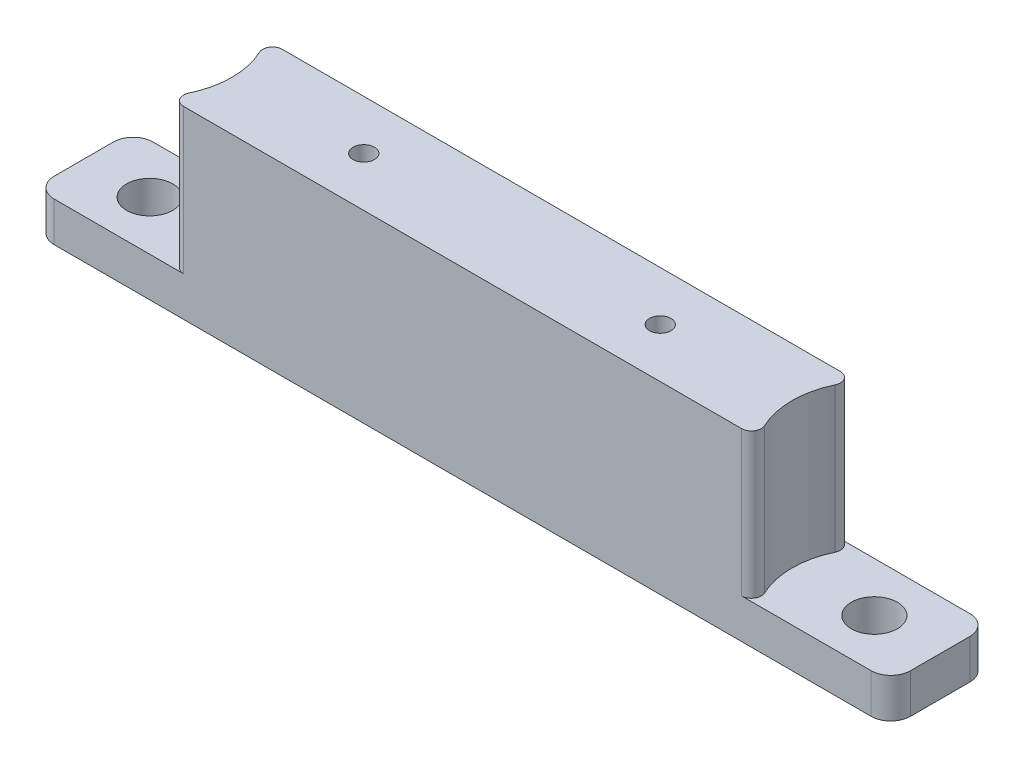
ISO-10303-21;
HEADER;
FILE_DESCRIPTION(('STEP AP214'),'2;1');
FILE_NAME('part.step','',(''),(''),'','','');
FILE_SCHEMA(('AUTOMOTIVE_DESIGN { 1 0 10303 214 1 1 1 1 }'));
ENDSEC;
DATA;
#1=APPLICATION_CONTEXT('core data for automotive mechanical design processes');
#2=APPLICATION_PROTOCOL_DEFINITION('international standard','automotive_design',2000,#1);
#3=PRODUCT_CONTEXT('',#1,'mechanical');
#4=PRODUCT('Part','Part','',(#3));
#5=PRODUCT_RELATED_PRODUCT_CATEGORY('part','',(#4));
#6=PRODUCT_DEFINITION_FORMATION('','',#4);
#7=PRODUCT_DEFINITION_CONTEXT('part definition',#1,'design');
#8=PRODUCT_DEFINITION('design','',#6,#7);
#9=PRODUCT_DEFINITION_SHAPE('','',#8);
#10=(LENGTH_UNIT() NAMED_UNIT(*) SI_UNIT(.MILLI.,.METRE.));
#11=(NAMED_UNIT(*) PLANE_ANGLE_UNIT() SI_UNIT($,.RADIAN.));
#12=(NAMED_UNIT(*) SI_UNIT($,.STERADIAN.) SOLID_ANGLE_UNIT());
#13=UNCERTAINTY_MEASURE_WITH_UNIT(LENGTH_MEASURE(1.E-05),#10,'distance_accuracy_value','');
#14=(GEOMETRIC_REPRESENTATION_CONTEXT(3) GLOBAL_UNCERTAINTY_ASSIGNED_CONTEXT((#13)) GLOBAL_UNIT_ASSIGNED_CONTEXT((#10,
#11,#12)) REPRESENTATION_CONTEXT('',''));
#15=CARTESIAN_POINT('',(0.,0.,0.));
#16=DIRECTION('',(0.,0.,1.));
#17=DIRECTION('',(1.,0.,0.));
#18=AXIS2_PLACEMENT_3D('',#15,#16,#17);
#19=CARTESIAN_POINT('',(87.5,-0.001000000000001,-7.5));
#20=DIRECTION('',(0.,1.,0.));
#21=DIRECTION('',(0.,0.,1.));
#22=AXIS2_PLACEMENT_3D('',#19,#20,#21);
#23=CYLINDRICAL_SURFACE('',#22,1.625);
#24=CARTESIAN_POINT('',(87.5,28.,-7.5));
#25=DIRECTION('',(0.,1.,0.));
#26=DIRECTION('',(0.,0.,1.));
#27=AXIS2_PLACEMENT_3D('',#24,#25,#26);
#28=CIRCLE('',#27,1.625);
#29=CARTESIAN_POINT('',(87.5,28.,-5.875));
#30=VERTEX_POINT('',#29);
#31=EDGE_CURVE('E191',#30,#30,#28,.T.);
#32=ORIENTED_EDGE('',*,*,#31,.T.);
#33=EDGE_LOOP('',(#32));
#34=FACE_BOUND('',#33,.T.);
#35=CARTESIAN_POINT('',(87.5,25.5,-7.5));
#36=DIRECTION('',(0.,-1.,0.));
#37=DIRECTION('',(0.,0.,-1.));
#38=AXIS2_PLACEMENT_3D('',#35,#36,#37);
#39=CIRCLE('',#38,1.625);
#40=CARTESIAN_POINT('',(87.5,25.5,-9.12500000000001));
#41=VERTEX_POINT('',#40);
#42=EDGE_CURVE('E187',#41,#41,#39,.F.);
#43=ORIENTED_EDGE('',*,*,#42,.F.);
#44=EDGE_LOOP('',(#43));
#45=FACE_BOUND('',#44,.T.);
#46=ADVANCED_FACE('F33',(#34,#45),#23,.F.);
#47=CARTESIAN_POINT('',(42.5,-0.001000000000001,-7.5));
#48=DIRECTION('',(0.,1.,0.));
#49=DIRECTION('',(0.,0.,1.));
#50=AXIS2_PLACEMENT_3D('',#47,#48,#49);
#51=CYLINDRICAL_SURFACE('',#50,1.625);
#52=CARTESIAN_POINT('',(42.5,28.,-7.5));
#53=DIRECTION('',(0.,1.,0.));
#54=DIRECTION('',(0.,0.,1.));
#55=AXIS2_PLACEMENT_3D('',#52,#53,#54);
#56=CIRCLE('',#55,1.625);
#57=CARTESIAN_POINT('',(42.5,28.,-5.875));
#58=VERTEX_POINT('',#57);
#59=EDGE_CURVE('E373',#58,#58,#56,.T.);
#60=ORIENTED_EDGE('',*,*,#59,.T.);
#61=EDGE_LOOP('',(#60));
#62=FACE_BOUND('',#61,.T.);
#63=CARTESIAN_POINT('',(42.5,25.5,-7.5));
#64=DIRECTION('',(0.,-1.,0.));
#65=DIRECTION('',(0.,0.,-1.));
#66=AXIS2_PLACEMENT_3D('',#63,#64,#65);
#67=CIRCLE('',#66,1.625);
#68=CARTESIAN_POINT('',(42.5,25.5,-9.12500000000001));
#69=VERTEX_POINT('',#68);
#70=EDGE_CURVE('E184',#69,#69,#67,.F.);
#71=ORIENTED_EDGE('',*,*,#70,.F.);
#72=EDGE_LOOP('',(#71));
#73=FACE_BOUND('',#72,.T.);
#74=ADVANCED_FACE('F305',(#62,#73),#51,.F.);
#75=CARTESIAN_POINT('',(0.,28.,0.));
#76=DIRECTION('',(0.,1.,0.));
#77=DIRECTION('',(0.,0.,1.));
#78=AXIS2_PLACEMENT_3D('',#75,#76,#77);
#79=PLANE('',#78);
#80=ORIENTED_EDGE('',*,*,#59,.F.);
#81=EDGE_LOOP('',(#80));
#82=FACE_BOUND('',#81,.T.);
#83=ORIENTED_EDGE('',*,*,#31,.F.);
#84=EDGE_LOOP('',(#83));
#85=FACE_BOUND('',#84,.T.);
#86=CARTESIAN_POINT('',(120.,28.,-7.5));
#87=DIRECTION('',(0.,1.,0.));
#88=DIRECTION('',(0.,0.,1.));
#89=AXIS2_PLACEMENT_3D('',#86,#87,#88);
#90=CIRCLE('',#89,12.5);
#91=CARTESIAN_POINT('',(108.706151213684,28.,-12.8571428571429));
#92=VERTEX_POINT('',#91);
#93=CARTESIAN_POINT('',(108.706151213684,28.,-2.14285714285714));
#94=VERTEX_POINT('',#93);
#95=EDGE_CURVE('E368',#92,#94,#90,.T.);
#96=ORIENTED_EDGE('',*,*,#95,.F.);
#97=CARTESIAN_POINT('',(107.350889359326,28.,-13.5));
#98=DIRECTION('',(0.,1.,0.));
#99=DIRECTION('',(0.,0.,1.));
#100=AXIS2_PLACEMENT_3D('',#97,#98,#99);
#101=CIRCLE('',#100,1.5);
#102=CARTESIAN_POINT('',(107.350889359326,28.,-15.));
#103=VERTEX_POINT('',#102);
#104=EDGE_CURVE('E232',#92,#103,#101,.T.);
#105=ORIENTED_EDGE('',*,*,#104,.T.);
#106=DIRECTION('',(-1.,0.,0.));
#107=VECTOR('',#106,1.);
#108=CARTESIAN_POINT('',(20.,28.,-15.));
#109=LINE('',#108,#107);
#110=CARTESIAN_POINT('',(22.6491106406735,28.,-15.));
#111=VERTEX_POINT('',#110);
#112=EDGE_CURVE('E255',#103,#111,#109,.T.);
#113=ORIENTED_EDGE('',*,*,#112,.T.);
#114=CARTESIAN_POINT('',(22.6491106406735,28.,-13.5));
#115=DIRECTION('',(0.,1.,0.));
#116=DIRECTION('',(0.,0.,1.));
#117=AXIS2_PLACEMENT_3D('',#114,#115,#116);
#118=CIRCLE('',#117,1.5);
#119=CARTESIAN_POINT('',(21.2938487863156,28.,-12.8571428571429));
#120=VERTEX_POINT('',#119);
#121=EDGE_CURVE('E228',#111,#120,#118,.T.);
#122=ORIENTED_EDGE('',*,*,#121,.T.);
#123=CARTESIAN_POINT('',(10.,28.,-7.5));
#124=DIRECTION('',(0.,1.,0.));
#125=DIRECTION('',(0.,0.,1.));
#126=AXIS2_PLACEMENT_3D('',#123,#124,#125);
#127=CIRCLE('',#126,12.5);
#128=CARTESIAN_POINT('',(21.2938487863156,28.,-2.14285714285714));
#129=VERTEX_POINT('',#128);
#130=EDGE_CURVE('E360',#129,#120,#127,.T.);
#131=ORIENTED_EDGE('',*,*,#130,.F.);
#132=CARTESIAN_POINT('',(22.6491106406735,28.,-1.5));
#133=DIRECTION('',(0.,1.,0.));
#134=DIRECTION('',(0.,0.,1.));
#135=AXIS2_PLACEMENT_3D('',#132,#133,#134);
#136=CIRCLE('',#135,1.5);
#137=CARTESIAN_POINT('',(22.6491106406735,28.,0.));
#138=VERTEX_POINT('',#137);
#139=EDGE_CURVE('E226',#129,#138,#136,.T.);
#140=ORIENTED_EDGE('',*,*,#139,.T.);
#141=DIRECTION('',(1.,0.,0.));
#142=VECTOR('',#141,1.);
#143=CARTESIAN_POINT('',(20.,28.,0.));
#144=LINE('',#143,#142);
#145=CARTESIAN_POINT('',(107.350889359326,28.,0.));
#146=VERTEX_POINT('',#145);
#147=EDGE_CURVE('E264',#138,#146,#144,.T.);
#148=ORIENTED_EDGE('',*,*,#147,.T.);
#149=CARTESIAN_POINT('',(107.350889359326,28.,-1.5));
#150=DIRECTION('',(0.,1.,0.));
#151=DIRECTION('',(0.,0.,1.));
#152=AXIS2_PLACEMENT_3D('',#149,#150,#151);
#153=CIRCLE('',#152,1.5);
#154=EDGE_CURVE('E230',#146,#94,#153,.T.);
#155=ORIENTED_EDGE('',*,*,#154,.T.);
#156=EDGE_LOOP('',(#96,#105,#113,#122,#131,#140,#148,#155));
#157=FACE_BOUND('',#156,.T.);
#158=ADVANCED_FACE('F259',(#82,#85,#157),#79,.T.);
#159=CARTESIAN_POINT('',(0.,6.,0.));
#160=DIRECTION('',(0.,-1.,0.));
#161=DIRECTION('',(0.,0.,-1.));
#162=AXIS2_PLACEMENT_3D('',#159,#160,#161);
#163=PLANE('',#162);
#164=CARTESIAN_POINT('',(10.,6.,-7.5));
#165=DIRECTION('',(0.,1.,0.));
#166=DIRECTION('',(0.,0.,1.));
#167=AXIS2_PLACEMENT_3D('',#164,#165,#166);
#168=CIRCLE('',#167,3.5);
#169=CARTESIAN_POINT('',(10.,6.,-4.));
#170=VERTEX_POINT('',#169);
#171=EDGE_CURVE('E269',#170,#170,#168,.T.);
#172=ORIENTED_EDGE('',*,*,#171,.F.);
#173=EDGE_LOOP('',(#172));
#174=FACE_BOUND('',#173,.T.);
#175=DIRECTION('',(-1.,0.,0.));
#176=VECTOR('',#175,1.);
#177=CARTESIAN_POINT('',(0.,6.,-15.));
#178=LINE('',#177,#176);
#179=CARTESIAN_POINT('',(22.6491106406735,6.,-15.));
#180=VERTEX_POINT('',#179);
#181=CARTESIAN_POINT('',(3.,6.,-15.));
#182=VERTEX_POINT('',#181);
#183=EDGE_CURVE('E249',#180,#182,#178,.T.);
#184=ORIENTED_EDGE('',*,*,#183,.T.);
#185=CARTESIAN_POINT('',(3.,6.,-12.));
#186=DIRECTION('',(0.,-1.,0.));
#187=DIRECTION('',(0.,0.,-1.));
#188=AXIS2_PLACEMENT_3D('',#185,#186,#187);
#189=CIRCLE('',#188,3.);
#190=CARTESIAN_POINT('',(0.,6.,-12.));
#191=VERTEX_POINT('',#190);
#192=EDGE_CURVE('E215',#182,#191,#189,.F.);
#193=ORIENTED_EDGE('',*,*,#192,.T.);
#194=DIRECTION('',(0.,0.,1.));
#195=VECTOR('',#194,1.);
#196=CARTESIAN_POINT('',(0.,6.,0.));
#197=LINE('',#196,#195);
#198=CARTESIAN_POINT('',(0.,6.,-3.));
#199=VERTEX_POINT('',#198);
#200=EDGE_CURVE('E174',#191,#199,#197,.T.);
#201=ORIENTED_EDGE('',*,*,#200,.T.);
#202=CARTESIAN_POINT('',(3.,6.,-3.));
#203=DIRECTION('',(0.,-1.,0.));
#204=DIRECTION('',(0.,0.,-1.));
#205=AXIS2_PLACEMENT_3D('',#202,#203,#204);
#206=CIRCLE('',#205,3.);
#207=CARTESIAN_POINT('',(3.,6.,0.));
#208=VERTEX_POINT('',#207);
#209=EDGE_CURVE('E213',#199,#208,#206,.F.);
#210=ORIENTED_EDGE('',*,*,#209,.T.);
#211=DIRECTION('',(1.,0.,0.));
#212=VECTOR('',#211,1.);
#213=CARTESIAN_POINT('',(0.,6.,0.));
#214=LINE('',#213,#212);
#215=CARTESIAN_POINT('',(22.6491106406735,6.,0.));
#216=VERTEX_POINT('',#215);
#217=EDGE_CURVE('E273',#208,#216,#214,.T.);
#218=ORIENTED_EDGE('',*,*,#217,.T.);
#219=CARTESIAN_POINT('',(22.6491106406735,6.,-1.5));
#220=DIRECTION('',(0.,-1.,0.));
#221=DIRECTION('',(0.,0.,-1.));
#222=AXIS2_PLACEMENT_3D('',#219,#220,#221);
#223=CIRCLE('',#222,1.5);
#224=CARTESIAN_POINT('',(21.2938487863156,6.,-2.14285714285714));
#225=VERTEX_POINT('',#224);
#226=EDGE_CURVE('E11',#216,#225,#223,.T.);
#227=ORIENTED_EDGE('',*,*,#226,.T.);
#228=CARTESIAN_POINT('',(10.,6.,-7.5));
#229=DIRECTION('',(0.,1.,0.));
#230=DIRECTION('',(0.,0.,1.));
#231=AXIS2_PLACEMENT_3D('',#228,#229,#230);
#232=CIRCLE('',#231,12.5);
#233=CARTESIAN_POINT('',(21.2938487863156,6.,-12.8571428571429));
#234=VERTEX_POINT('',#233);
#235=EDGE_CURVE('E251',#225,#234,#232,.T.);
#236=ORIENTED_EDGE('',*,*,#235,.T.);
#237=CARTESIAN_POINT('',(22.6491106406735,6.,-13.5));
#238=DIRECTION('',(0.,-1.,0.));
#239=DIRECTION('',(0.,0.,-1.));
#240=AXIS2_PLACEMENT_3D('',#237,#238,#239);
#241=CIRCLE('',#240,1.5);
#242=EDGE_CURVE('E41',#234,#180,#241,.T.);
#243=ORIENTED_EDGE('',*,*,#242,.T.);
#244=EDGE_LOOP('',(#184,#193,#201,#210,#218,#227,#236,#243));
#245=FACE_BOUND('',#244,.T.);
#246=ADVANCED_FACE('F248',(#174,#245),#163,.F.);
#247=CARTESIAN_POINT('',(120.,6.,-7.5));
#248=DIRECTION('',(0.,1.,0.));
#249=DIRECTION('',(0.,0.,1.));
#250=AXIS2_PLACEMENT_3D('',#247,#248,#249);
#251=CIRCLE('',#250,3.50000000000001);
#252=CARTESIAN_POINT('',(120.,6.,-3.99999999999999));
#253=VERTEX_POINT('',#252);
#254=EDGE_CURVE('E359',#253,#253,#251,.T.);
#255=ORIENTED_EDGE('',*,*,#254,.F.);
#256=EDGE_LOOP('',(#255));
#257=FACE_BOUND('',#256,.T.);
#258=DIRECTION('',(0.,0.,-1.));
#259=VECTOR('',#258,1.);
#260=CARTESIAN_POINT('',(130.,6.,0.));
#261=LINE('',#260,#259);
#262=CARTESIAN_POINT('',(130.,6.,-3.));
#263=VERTEX_POINT('',#262);
#264=CARTESIAN_POINT('',(130.,6.,-12.));
#265=VERTEX_POINT('',#264);
#266=EDGE_CURVE('E275',#263,#265,#261,.T.);
#267=ORIENTED_EDGE('',*,*,#266,.T.);
#268=CARTESIAN_POINT('',(127.,6.,-12.));
#269=DIRECTION('',(0.,-1.,0.));
#270=DIRECTION('',(0.,0.,-1.));
#271=AXIS2_PLACEMENT_3D('',#268,#269,#270);
#272=CIRCLE('',#271,3.);
#273=CARTESIAN_POINT('',(127.,6.,-15.));
#274=VERTEX_POINT('',#273);
#275=EDGE_CURVE('E201',#265,#274,#272,.F.);
#276=ORIENTED_EDGE('',*,*,#275,.T.);
#277=CARTESIAN_POINT('',(107.350889359326,6.,-15.));
#278=VERTEX_POINT('',#277);
#279=EDGE_CURVE('E167',#274,#278,#178,.T.);
#280=ORIENTED_EDGE('',*,*,#279,.T.);
#281=CARTESIAN_POINT('',(107.350889359326,6.,-13.5));
#282=DIRECTION('',(0.,-1.,0.));
#283=DIRECTION('',(0.,0.,-1.));
#284=AXIS2_PLACEMENT_3D('',#281,#282,#283);
#285=CIRCLE('',#284,1.5);
#286=CARTESIAN_POINT('',(108.706151213684,6.,-12.8571428571429));
#287=VERTEX_POINT('',#286);
#288=EDGE_CURVE('E243',#278,#287,#285,.T.);
#289=ORIENTED_EDGE('',*,*,#288,.T.);
#290=CARTESIAN_POINT('',(120.,6.,-7.5));
#291=DIRECTION('',(0.,1.,0.));
#292=DIRECTION('',(0.,0.,1.));
#293=AXIS2_PLACEMENT_3D('',#290,#291,#292);
#294=CIRCLE('',#293,12.5);
#295=CARTESIAN_POINT('',(108.706151213684,6.,-2.14285714285714));
#296=VERTEX_POINT('',#295);
#297=EDGE_CURVE('E371',#287,#296,#294,.T.);
#298=ORIENTED_EDGE('',*,*,#297,.T.);
#299=CARTESIAN_POINT('',(107.350889359326,6.,-1.5));
#300=DIRECTION('',(0.,-1.,0.));
#301=DIRECTION('',(0.,0.,-1.));
#302=AXIS2_PLACEMENT_3D('',#299,#300,#301);
#303=CIRCLE('',#302,1.5);
#304=CARTESIAN_POINT('',(107.350889359326,6.,0.));
#305=VERTEX_POINT('',#304);
#306=EDGE_CURVE('E245',#296,#305,#303,.T.);
#307=ORIENTED_EDGE('',*,*,#306,.T.);
#308=CARTESIAN_POINT('',(127.,6.,0.));
#309=VERTEX_POINT('',#308);
#310=EDGE_CURVE('E178',#305,#309,#214,.T.);
#311=ORIENTED_EDGE('',*,*,#310,.T.);
#312=CARTESIAN_POINT('',(127.,6.,-3.));
#313=DIRECTION('',(0.,-1.,0.));
#314=DIRECTION('',(0.,0.,-1.));
#315=AXIS2_PLACEMENT_3D('',#312,#313,#314);
#316=CIRCLE('',#315,3.);
#317=EDGE_CURVE('E199',#309,#263,#316,.F.);
#318=ORIENTED_EDGE('',*,*,#317,.T.);
#319=EDGE_LOOP('',(#267,#276,#280,#289,#298,#307,#311,#318));
#320=FACE_BOUND('',#319,.T.);
#321=ADVANCED_FACE('F292',(#257,#320),#163,.F.);
#322=CARTESIAN_POINT('',(0.,6.,0.));
#323=DIRECTION('',(1.,0.,0.));
#324=DIRECTION('',(0.,0.,-1.));
#325=AXIS2_PLACEMENT_3D('',#322,#323,#324);
#326=PLANE('',#325);
#327=ORIENTED_EDGE('',*,*,#200,.F.);
#328=DIRECTION('',(0.,-1.,0.));
#329=VECTOR('',#328,1.);
#330=CARTESIAN_POINT('',(0.,6.,-12.));
#331=LINE('',#330,#329);
#332=CARTESIAN_POINT('',(0.,0.,-12.));
#333=VERTEX_POINT('',#332);
#334=EDGE_CURVE('E210',#191,#333,#331,.T.);
#335=ORIENTED_EDGE('',*,*,#334,.T.);
#336=DIRECTION('',(0.,0.,1.));
#337=VECTOR('',#336,1.);
#338=CARTESIAN_POINT('',(0.,0.,0.));
#339=LINE('',#338,#337);
#340=CARTESIAN_POINT('',(0.,0.,-3.));
#341=VERTEX_POINT('',#340);
#342=EDGE_CURVE('E263',#333,#341,#339,.T.);
#343=ORIENTED_EDGE('',*,*,#342,.T.);
#344=DIRECTION('',(0.,-1.,0.));
#345=VECTOR('',#344,1.);
#346=CARTESIAN_POINT('',(0.,6.,-3.));
#347=LINE('',#346,#345);
#348=EDGE_CURVE('E208',#341,#199,#347,.F.);
#349=ORIENTED_EDGE('',*,*,#348,.T.);
#350=EDGE_LOOP('',(#327,#335,#343,#349));
#351=FACE_BOUND('',#350,.T.);
#352=ADVANCED_FACE('F302',(#351),#326,.F.);
#353=CARTESIAN_POINT('',(0.,6.,0.));
#354=DIRECTION('',(0.,0.,-1.));
#355=DIRECTION('',(-1.,0.,0.));
#356=AXIS2_PLACEMENT_3D('',#353,#354,#355);
#357=PLANE('',#356);
#358=ORIENTED_EDGE('',*,*,#310,.F.);
#359=DIRECTION('',(0.,1.,0.));
#360=VECTOR('',#359,1.);
#361=CARTESIAN_POINT('',(107.350889359326,28.,0.));
#362=LINE('',#361,#360);
#363=EDGE_CURVE('E237',#305,#146,#362,.T.);
#364=ORIENTED_EDGE('',*,*,#363,.T.);
#365=ORIENTED_EDGE('',*,*,#147,.F.);
#366=DIRECTION('',(0.,1.,0.));
#367=VECTOR('',#366,1.);
#368=CARTESIAN_POINT('',(22.6491106406735,6.,0.));
#369=LINE('',#368,#367);
#370=EDGE_CURVE('E234',#138,#216,#369,.F.);
#371=ORIENTED_EDGE('',*,*,#370,.T.);
#372=ORIENTED_EDGE('',*,*,#217,.F.);
#373=DIRECTION('',(0.,-1.,0.));
#374=VECTOR('',#373,1.);
#375=CARTESIAN_POINT('',(3.,6.,0.));
#376=LINE('',#375,#374);
#377=CARTESIAN_POINT('',(3.,0.,0.));
#378=VERTEX_POINT('',#377);
#379=EDGE_CURVE('E203',#208,#378,#376,.T.);
#380=ORIENTED_EDGE('',*,*,#379,.T.);
#381=DIRECTION('',(1.,0.,0.));
#382=VECTOR('',#381,1.);
#383=CARTESIAN_POINT('',(0.,0.,0.));
#384=LINE('',#383,#382);
#385=CARTESIAN_POINT('',(127.,0.,0.));
#386=VERTEX_POINT('',#385);
#387=EDGE_CURVE('E180',#378,#386,#384,.T.);
#388=ORIENTED_EDGE('',*,*,#387,.T.);
#389=DIRECTION('',(0.,-1.,0.));
#390=VECTOR('',#389,1.);
#391=CARTESIAN_POINT('',(127.,6.,0.));
#392=LINE('',#391,#390);
#393=EDGE_CURVE('E206',#386,#309,#392,.F.);
#394=ORIENTED_EDGE('',*,*,#393,.T.);
#395=EDGE_LOOP('',(#358,#364,#365,#371,#372,#380,#388,#394));
#396=FACE_BOUND('',#395,.T.);
#397=ADVANCED_FACE('F282',(#396),#357,.F.);
#398=CARTESIAN_POINT('',(130.,6.,0.));
#399=DIRECTION('',(-1.,0.,0.));
#400=DIRECTION('',(0.,0.,1.));
#401=AXIS2_PLACEMENT_3D('',#398,#399,#400);
#402=PLANE('',#401);
#403=DIRECTION('',(0.,0.,-1.));
#404=VECTOR('',#403,1.);
#405=CARTESIAN_POINT('',(130.,0.,0.));
#406=LINE('',#405,#404);
#407=CARTESIAN_POINT('',(130.,0.,-3.));
#408=VERTEX_POINT('',#407);
#409=CARTESIAN_POINT('',(130.,0.,-12.));
#410=VERTEX_POINT('',#409);
#411=EDGE_CURVE('E175',#408,#410,#406,.T.);
#412=ORIENTED_EDGE('',*,*,#411,.T.);
#413=DIRECTION('',(0.,-1.,0.));
#414=VECTOR('',#413,1.);
#415=CARTESIAN_POINT('',(130.,6.,-12.));
#416=LINE('',#415,#414);
#417=EDGE_CURVE('E151',#410,#265,#416,.F.);
#418=ORIENTED_EDGE('',*,*,#417,.T.);
#419=ORIENTED_EDGE('',*,*,#266,.F.);
#420=DIRECTION('',(0.,-1.,0.));
#421=VECTOR('',#420,1.);
#422=CARTESIAN_POINT('',(130.,6.,-3.));
#423=LINE('',#422,#421);
#424=EDGE_CURVE('E156',#263,#408,#423,.T.);
#425=ORIENTED_EDGE('',*,*,#424,.T.);
#426=EDGE_LOOP('',(#412,#418,#419,#425));
#427=FACE_BOUND('',#426,.T.);
#428=ADVANCED_FACE('F294',(#427),#402,.F.);
#429=CARTESIAN_POINT('',(0.,6.,-15.));
#430=DIRECTION('',(0.,0.,1.));
#431=DIRECTION('',(1.,0.,0.));
#432=AXIS2_PLACEMENT_3D('',#429,#430,#431);
#433=PLANE('',#432);
#434=ORIENTED_EDGE('',*,*,#112,.F.);
#435=DIRECTION('',(0.,1.,0.));
#436=VECTOR('',#435,1.);
#437=CARTESIAN_POINT('',(107.350889359326,6.,-15.));
#438=LINE('',#437,#436);
#439=EDGE_CURVE('E219',#103,#278,#438,.F.);
#440=ORIENTED_EDGE('',*,*,#439,.T.);
#441=ORIENTED_EDGE('',*,*,#279,.F.);
#442=DIRECTION('',(0.,-1.,0.));
#443=VECTOR('',#442,1.);
#444=CARTESIAN_POINT('',(127.,6.,-15.));
#445=LINE('',#444,#443);
#446=CARTESIAN_POINT('',(127.,0.,-15.));
#447=VERTEX_POINT('',#446);
#448=EDGE_CURVE('E150',#274,#447,#445,.T.);
#449=ORIENTED_EDGE('',*,*,#448,.T.);
#450=DIRECTION('',(-1.,0.,0.));
#451=VECTOR('',#450,1.);
#452=CARTESIAN_POINT('',(0.,0.,-15.));
#453=LINE('',#452,#451);
#454=CARTESIAN_POINT('',(3.,0.,-15.));
#455=VERTEX_POINT('',#454);
#456=EDGE_CURVE('E164',#447,#455,#453,.T.);
#457=ORIENTED_EDGE('',*,*,#456,.T.);
#458=DIRECTION('',(0.,-1.,0.));
#459=VECTOR('',#458,1.);
#460=CARTESIAN_POINT('',(3.,6.,-15.));
#461=LINE('',#460,#459);
#462=EDGE_CURVE('E169',#455,#182,#461,.F.);
#463=ORIENTED_EDGE('',*,*,#462,.T.);
#464=ORIENTED_EDGE('',*,*,#183,.F.);
#465=DIRECTION('',(0.,1.,0.));
#466=VECTOR('',#465,1.);
#467=CARTESIAN_POINT('',(22.6491106406735,28.,-15.));
#468=LINE('',#467,#466);
#469=EDGE_CURVE('E217',#180,#111,#468,.T.);
#470=ORIENTED_EDGE('',*,*,#469,.T.);
#471=EDGE_LOOP('',(#434,#440,#441,#449,#457,#463,#464,#470));
#472=FACE_BOUND('',#471,.T.);
#473=ADVANCED_FACE('F163',(#472),#433,.F.);
#474=CARTESIAN_POINT('',(0.,0.,0.));
#475=DIRECTION('',(0.,-1.,0.));
#476=DIRECTION('',(0.,0.,-1.));
#477=AXIS2_PLACEMENT_3D('',#474,#475,#476);
#478=PLANE('',#477);
#479=CARTESIAN_POINT('',(42.5,0.,-7.5));
#480=DIRECTION('',(0.,-1.,0.));
#481=DIRECTION('',(0.,0.,-1.));
#482=AXIS2_PLACEMENT_3D('',#479,#480,#481);
#483=CIRCLE('',#482,3.5);
#484=CARTESIAN_POINT('',(42.5,0.,-11.));
#485=VERTEX_POINT('',#484);
#486=EDGE_CURVE('E347',#485,#485,#483,.T.);
#487=ORIENTED_EDGE('',*,*,#486,.F.);
#488=EDGE_LOOP('',(#487));
#489=FACE_BOUND('',#488,.T.);
#490=CARTESIAN_POINT('',(87.5,0.,-7.5));
#491=DIRECTION('',(0.,-1.,0.));
#492=DIRECTION('',(0.,0.,-1.));
#493=AXIS2_PLACEMENT_3D('',#490,#491,#492);
#494=CIRCLE('',#493,3.50000000000001);
#495=CARTESIAN_POINT('',(87.5,0.,-11.));
#496=VERTEX_POINT('',#495);
#497=EDGE_CURVE('E351',#496,#496,#494,.T.);
#498=ORIENTED_EDGE('',*,*,#497,.F.);
#499=EDGE_LOOP('',(#498));
#500=FACE_BOUND('',#499,.T.);
#501=CARTESIAN_POINT('',(10.,0.,-7.5));
#502=DIRECTION('',(0.,-1.,0.));
#503=DIRECTION('',(0.,0.,-1.));
#504=AXIS2_PLACEMENT_3D('',#501,#502,#503);
#505=CIRCLE('',#504,3.5);
#506=CARTESIAN_POINT('',(10.,0.,-4.));
#507=VERTEX_POINT('',#506);
#508=EDGE_CURVE('E355',#507,#507,#505,.F.);
#509=ORIENTED_EDGE('',*,*,#508,.T.);
#510=EDGE_LOOP('',(#509));
#511=FACE_BOUND('',#510,.T.);
#512=CARTESIAN_POINT('',(120.,0.,-7.5));
#513=DIRECTION('',(0.,-1.,0.));
#514=DIRECTION('',(0.,0.,-1.));
#515=AXIS2_PLACEMENT_3D('',#512,#513,#514);
#516=CIRCLE('',#515,3.50000000000001);
#517=CARTESIAN_POINT('',(120.,0.,-3.99999999999999));
#518=VERTEX_POINT('',#517);
#519=EDGE_CURVE('E358',#518,#518,#516,.F.);
#520=ORIENTED_EDGE('',*,*,#519,.T.);
#521=EDGE_LOOP('',(#520));
#522=FACE_BOUND('',#521,.T.);
#523=ORIENTED_EDGE('',*,*,#456,.F.);
#524=CARTESIAN_POINT('',(127.,0.,-12.));
#525=DIRECTION('',(0.,-1.,0.));
#526=DIRECTION('',(0.,0.,-1.));
#527=AXIS2_PLACEMENT_3D('',#524,#525,#526);
#528=CIRCLE('',#527,3.);
#529=EDGE_CURVE('E146',#447,#410,#528,.T.);
#530=ORIENTED_EDGE('',*,*,#529,.T.);
#531=ORIENTED_EDGE('',*,*,#411,.F.);
#532=CARTESIAN_POINT('',(127.,0.,-3.));
#533=DIRECTION('',(0.,-1.,0.));
#534=DIRECTION('',(0.,0.,-1.));
#535=AXIS2_PLACEMENT_3D('',#532,#533,#534);
#536=CIRCLE('',#535,3.);
#537=EDGE_CURVE('E157',#408,#386,#536,.T.);
#538=ORIENTED_EDGE('',*,*,#537,.T.);
#539=ORIENTED_EDGE('',*,*,#387,.F.);
#540=CARTESIAN_POINT('',(3.,0.,-3.));
#541=DIRECTION('',(0.,-1.,0.));
#542=DIRECTION('',(0.,0.,-1.));
#543=AXIS2_PLACEMENT_3D('',#540,#541,#542);
#544=CIRCLE('',#543,3.);
#545=EDGE_CURVE('E168',#378,#341,#544,.T.);
#546=ORIENTED_EDGE('',*,*,#545,.T.);
#547=ORIENTED_EDGE('',*,*,#342,.F.);
#548=CARTESIAN_POINT('',(3.,0.,-12.));
#549=DIRECTION('',(0.,-1.,0.));
#550=DIRECTION('',(0.,0.,-1.));
#551=AXIS2_PLACEMENT_3D('',#548,#549,#550);
#552=CIRCLE('',#551,3.);
#553=EDGE_CURVE('E173',#333,#455,#552,.T.);
#554=ORIENTED_EDGE('',*,*,#553,.T.);
#555=EDGE_LOOP('',(#523,#530,#531,#538,#539,#546,#547,#554));
#556=FACE_BOUND('',#555,.T.);
#557=ADVANCED_FACE('F171',(#489,#500,#511,#522,#556),#478,.T.);
#558=CARTESIAN_POINT('',(120.,-0.00100000000000013,-7.5));
#559=DIRECTION('',(0.,1.,0.));
#560=DIRECTION('',(0.,0.,1.));
#561=AXIS2_PLACEMENT_3D('',#558,#559,#560);
#562=CYLINDRICAL_SURFACE('',#561,3.50000000000001);
#563=CARTESIAN_POINT('',(120.,0.,-3.99999999999999));
#564=CARTESIAN_POINT('',(120.,0.0624999999999999,-3.99999999999999));
#565=CARTESIAN_POINT('',(120.,0.125,-3.99999999999999));
#566=CARTESIAN_POINT('',(120.,0.25,-3.99999999999999));
#567=CARTESIAN_POINT('',(120.,0.3125,-3.99999999999999));
#568=CARTESIAN_POINT('',(120.,0.4375,-3.99999999999999));
#569=CARTESIAN_POINT('',(120.,0.5,-3.99999999999999));
#570=CARTESIAN_POINT('',(120.,0.625,-3.99999999999999));
#571=CARTESIAN_POINT('',(120.,0.6875,-3.99999999999999));
#572=CARTESIAN_POINT('',(120.,0.8125,-3.99999999999999));
#573=CARTESIAN_POINT('',(120.,0.875,-3.99999999999999));
#574=CARTESIAN_POINT('',(120.,1.,-3.99999999999999));
#575=CARTESIAN_POINT('',(120.,1.0625,-3.99999999999999));
#576=CARTESIAN_POINT('',(120.,1.1875,-3.99999999999999));
#577=CARTESIAN_POINT('',(120.,1.25,-3.99999999999999));
#578=CARTESIAN_POINT('',(120.,1.375,-3.99999999999999));
#579=CARTESIAN_POINT('',(120.,1.4375,-3.99999999999999));
#580=CARTESIAN_POINT('',(120.,1.5625,-3.99999999999999));
#581=CARTESIAN_POINT('',(120.,1.625,-3.99999999999999));
#582=CARTESIAN_POINT('',(120.,1.75,-3.99999999999999));
#583=CARTESIAN_POINT('',(120.,1.8125,-3.99999999999999));
#584=CARTESIAN_POINT('',(120.,1.9375,-3.99999999999999));
#585=CARTESIAN_POINT('',(120.,2.,-3.99999999999999));
#586=CARTESIAN_POINT('',(120.,2.125,-3.99999999999999));
#587=CARTESIAN_POINT('',(120.,2.1875,-3.99999999999999));
#588=CARTESIAN_POINT('',(120.,2.3125,-3.99999999999999));
#589=CARTESIAN_POINT('',(120.,2.375,-3.99999999999999));
#590=CARTESIAN_POINT('',(120.,2.5,-3.99999999999999));
#591=CARTESIAN_POINT('',(120.,2.5625,-3.99999999999999));
#592=CARTESIAN_POINT('',(120.,2.6875,-3.99999999999999));
#593=CARTESIAN_POINT('',(120.,2.75,-3.99999999999999));
#594=CARTESIAN_POINT('',(120.,2.875,-3.99999999999999));
#595=CARTESIAN_POINT('',(120.,2.9375,-3.99999999999999));
#596=CARTESIAN_POINT('',(120.,3.0625,-3.99999999999999));
#597=CARTESIAN_POINT('',(120.,3.125,-3.99999999999999));
#598=CARTESIAN_POINT('',(120.,3.25,-3.99999999999999));
#599=CARTESIAN_POINT('',(120.,3.3125,-3.99999999999999));
#600=CARTESIAN_POINT('',(120.,3.4375,-3.99999999999999));
#601=CARTESIAN_POINT('',(120.,3.5,-3.99999999999999));
#602=CARTESIAN_POINT('',(120.,3.625,-3.99999999999999));
#603=CARTESIAN_POINT('',(120.,3.6875,-3.99999999999999));
#604=CARTESIAN_POINT('',(120.,3.8125,-3.99999999999999));
#605=CARTESIAN_POINT('',(120.,3.875,-3.99999999999999));
#606=CARTESIAN_POINT('',(120.,4.,-3.99999999999999));
#607=CARTESIAN_POINT('',(120.,4.0625,-3.99999999999999));
#608=CARTESIAN_POINT('',(120.,4.1875,-3.99999999999999));
#609=CARTESIAN_POINT('',(120.,4.25,-3.99999999999999));
#610=CARTESIAN_POINT('',(120.,4.375,-3.99999999999999));
#611=CARTESIAN_POINT('',(120.,4.4375,-3.99999999999999));
#612=CARTESIAN_POINT('',(120.,4.5625,-3.99999999999999));
#613=CARTESIAN_POINT('',(120.,4.625,-3.99999999999999));
#614=CARTESIAN_POINT('',(120.,4.75,-3.99999999999999));
#615=CARTESIAN_POINT('',(120.,4.8125,-3.99999999999999));
#616=CARTESIAN_POINT('',(120.,4.9375,-3.99999999999999));
#617=CARTESIAN_POINT('',(120.,5.,-3.99999999999999));
#618=CARTESIAN_POINT('',(120.,5.125,-3.99999999999999));
#619=CARTESIAN_POINT('',(120.,5.1875,-3.99999999999999));
#620=CARTESIAN_POINT('',(120.,5.3125,-3.99999999999999));
#621=CARTESIAN_POINT('',(120.,5.375,-3.99999999999999));
#622=CARTESIAN_POINT('',(120.,5.5,-3.99999999999999));
#623=CARTESIAN_POINT('',(120.,5.5625,-3.99999999999999));
#624=CARTESIAN_POINT('',(120.,5.6875,-3.99999999999999));
#625=CARTESIAN_POINT('',(120.,5.75,-3.99999999999999));
#626=CARTESIAN_POINT('',(120.,5.875,-3.99999999999999));
#627=CARTESIAN_POINT('',(120.,5.9375,-3.99999999999999));
#628=CARTESIAN_POINT('',(120.,6.,-3.99999999999999));
#629=B_SPLINE_CURVE_WITH_KNOTS('',3,(#563,#564,#565,#566,#567,#568,#569,#570,#571,#572,#573,
#574,#575,#576,#577,#578,#579,#580,#581,#582,#583,#584,#585,#586,#587,#588,#589,#590,#591,#592,
#593,#594,#595,#596,#597,#598,#599,#600,#601,#602,#603,#604,#605,#606,#607,#608,#609,#610,#611,
#612,#613,#614,#615,#616,#617,#618,#619,#620,#621,#622,#623,#624,#625,#626,#627,#628),
.UNSPECIFIED.,.F.,.F.,(4,2,2,2,2,2,2,2,2,2,2,2,2,2,2,2,2,2,2,2,2,2,2,2,2,2,2,2,2,2,2,2,4),(0.,
0.1875,0.375,0.5625,0.75,0.9375,1.125,1.3125,1.5,1.6875,1.875,2.0625,2.25,2.4375,2.625,2.8125,
3.,3.1875,3.375,3.5625,3.75,3.9375,4.125,4.3125,4.5,4.6875,4.875,5.0625,5.25,5.4375,5.625,
5.8125,6.),.UNSPECIFIED.);
#630=EDGE_CURVE('BSEAM329',#518,#253,#629,.T.);
#631=ORIENTED_EDGE('',*,*,#519,.F.);
#632=ORIENTED_EDGE('',*,*,#254,.T.);
#633=ORIENTED_EDGE('',*,*,#630,.T.);
#634=ORIENTED_EDGE('',*,*,#630,.F.);
#635=EDGE_LOOP('',(#631,#633,#632,#634));
#636=FACE_BOUND('',#635,.T.);
#637=ADVANCED_FACE('F329',(#636),#562,.F.);
#638=CARTESIAN_POINT('',(10.,-0.00100000000000013,-7.5));
#639=DIRECTION('',(0.,1.,0.));
#640=DIRECTION('',(0.,0.,1.));
#641=AXIS2_PLACEMENT_3D('',#638,#639,#640);
#642=CYLINDRICAL_SURFACE('',#641,3.5);
#643=CARTESIAN_POINT('',(10.,0.,-4.));
#644=CARTESIAN_POINT('',(10.,0.0624999999999999,-4.));
#645=CARTESIAN_POINT('',(10.,0.125,-4.));
#646=CARTESIAN_POINT('',(10.,0.25,-4.));
#647=CARTESIAN_POINT('',(10.,0.3125,-4.));
#648=CARTESIAN_POINT('',(10.,0.4375,-4.));
#649=CARTESIAN_POINT('',(10.,0.5,-4.));
#650=CARTESIAN_POINT('',(10.,0.625,-4.));
#651=CARTESIAN_POINT('',(10.,0.6875,-4.));
#652=CARTESIAN_POINT('',(10.,0.8125,-4.));
#653=CARTESIAN_POINT('',(10.,0.875,-4.));
#654=CARTESIAN_POINT('',(10.,1.,-4.));
#655=CARTESIAN_POINT('',(10.,1.0625,-4.));
#656=CARTESIAN_POINT('',(10.,1.1875,-4.));
#657=CARTESIAN_POINT('',(10.,1.25,-4.));
#658=CARTESIAN_POINT('',(10.,1.375,-4.));
#659=CARTESIAN_POINT('',(10.,1.4375,-4.));
#660=CARTESIAN_POINT('',(10.,1.5625,-4.));
#661=CARTESIAN_POINT('',(10.,1.625,-4.));
#662=CARTESIAN_POINT('',(10.,1.75,-4.));
#663=CARTESIAN_POINT('',(10.,1.8125,-4.));
#664=CARTESIAN_POINT('',(10.,1.9375,-4.));
#665=CARTESIAN_POINT('',(10.,2.,-4.));
#666=CARTESIAN_POINT('',(10.,2.125,-4.));
#667=CARTESIAN_POINT('',(10.,2.1875,-4.));
#668=CARTESIAN_POINT('',(10.,2.3125,-4.));
#669=CARTESIAN_POINT('',(10.,2.375,-4.));
#670=CARTESIAN_POINT('',(10.,2.5,-4.));
#671=CARTESIAN_POINT('',(10.,2.5625,-4.));
#672=CARTESIAN_POINT('',(10.,2.6875,-4.));
#673=CARTESIAN_POINT('',(10.,2.75,-4.));
#674=CARTESIAN_POINT('',(10.,2.875,-4.));
#675=CARTESIAN_POINT('',(10.,2.9375,-4.));
#676=CARTESIAN_POINT('',(10.,3.0625,-4.));
#677=CARTESIAN_POINT('',(10.,3.125,-4.));
#678=CARTESIAN_POINT('',(10.,3.25,-4.));
#679=CARTESIAN_POINT('',(10.,3.3125,-4.));
#680=CARTESIAN_POINT('',(10.,3.4375,-4.));
#681=CARTESIAN_POINT('',(10.,3.5,-4.));
#682=CARTESIAN_POINT('',(10.,3.625,-4.));
#683=CARTESIAN_POINT('',(10.,3.6875,-4.));
#684=CARTESIAN_POINT('',(10.,3.8125,-4.));
#685=CARTESIAN_POINT('',(10.,3.875,-4.));
#686=CARTESIAN_POINT('',(10.,4.,-4.));
#687=CARTESIAN_POINT('',(10.,4.0625,-4.));
#688=CARTESIAN_POINT('',(10.,4.1875,-4.));
#689=CARTESIAN_POINT('',(10.,4.25,-4.));
#690=CARTESIAN_POINT('',(10.,4.375,-4.));
#691=CARTESIAN_POINT('',(10.,4.4375,-4.));
#692=CARTESIAN_POINT('',(10.,4.5625,-4.));
#693=CARTESIAN_POINT('',(10.,4.625,-4.));
#694=CARTESIAN_POINT('',(10.,4.75,-4.));
#695=CARTESIAN_POINT('',(10.,4.8125,-4.));
#696=CARTESIAN_POINT('',(10.,4.9375,-4.));
#697=CARTESIAN_POINT('',(10.,5.,-4.));
#698=CARTESIAN_POINT('',(10.,5.125,-4.));
#699=CARTESIAN_POINT('',(10.,5.1875,-4.));
#700=CARTESIAN_POINT('',(10.,5.3125,-4.));
#701=CARTESIAN_POINT('',(10.,5.375,-4.));
#702=CARTESIAN_POINT('',(10.,5.5,-4.));
#703=CARTESIAN_POINT('',(10.,5.5625,-4.));
#704=CARTESIAN_POINT('',(10.,5.6875,-4.));
#705=CARTESIAN_POINT('',(10.,5.75,-4.));
#706=CARTESIAN_POINT('',(10.,5.875,-4.));
#707=CARTESIAN_POINT('',(10.,5.9375,-4.));
#708=CARTESIAN_POINT('',(10.,6.,-4.));
#709=B_SPLINE_CURVE_WITH_KNOTS('',3,(#643,#644,#645,#646,#647,#648,#649,#650,#651,#652,#653,
#654,#655,#656,#657,#658,#659,#660,#661,#662,#663,#664,#665,#666,#667,#668,#669,#670,#671,#672,
#673,#674,#675,#676,#677,#678,#679,#680,#681,#682,#683,#684,#685,#686,#687,#688,#689,#690,#691,
#692,#693,#694,#695,#696,#697,#698,#699,#700,#701,#702,#703,#704,#705,#706,#707,#708),
.UNSPECIFIED.,.F.,.F.,(4,2,2,2,2,2,2,2,2,2,2,2,2,2,2,2,2,2,2,2,2,2,2,2,2,2,2,2,2,2,2,2,4),(0.,
0.1875,0.375,0.5625,0.75,0.9375,1.125,1.3125,1.5,1.6875,1.875,2.0625,2.25,2.4375,2.625,2.8125,
3.,3.1875,3.375,3.5625,3.75,3.9375,4.125,4.3125,4.5,4.6875,4.875,5.0625,5.25,5.4375,5.625,
5.8125,6.),.UNSPECIFIED.);
#710=EDGE_CURVE('BSEAM325',#507,#170,#709,.T.);
#711=ORIENTED_EDGE('',*,*,#508,.F.);
#712=ORIENTED_EDGE('',*,*,#171,.T.);
#713=ORIENTED_EDGE('',*,*,#710,.T.);
#714=ORIENTED_EDGE('',*,*,#710,.F.);
#715=EDGE_LOOP('',(#711,#713,#712,#714));
#716=FACE_BOUND('',#715,.T.);
#717=ADVANCED_FACE('F325',(#716),#642,.F.);
#718=CARTESIAN_POINT('',(120.,28.001,-7.5));
#719=DIRECTION('',(0.,-1.,0.));
#720=DIRECTION('',(0.,0.,-1.));
#721=AXIS2_PLACEMENT_3D('',#718,#719,#720);
#722=CYLINDRICAL_SURFACE('',#721,12.5);
#723=ORIENTED_EDGE('',*,*,#297,.F.);
#724=DIRECTION('',(0.,-1.,0.));
#725=VECTOR('',#724,1.);
#726=CARTESIAN_POINT('',(108.706151213684,28.001,-12.8571428571429));
#727=LINE('',#726,#725);
#728=EDGE_CURVE('E224',#287,#92,#727,.F.);
#729=ORIENTED_EDGE('',*,*,#728,.T.);
#730=ORIENTED_EDGE('',*,*,#95,.T.);
#731=DIRECTION('',(0.,-1.,0.));
#732=VECTOR('',#731,1.);
#733=CARTESIAN_POINT('',(108.706151213684,28.001,-2.14285714285714));
#734=LINE('',#733,#732);
#735=EDGE_CURVE('E221',#94,#296,#734,.T.);
#736=ORIENTED_EDGE('',*,*,#735,.T.);
#737=EDGE_LOOP('',(#723,#729,#730,#736));
#738=FACE_BOUND('',#737,.T.);
#739=ADVANCED_FACE('F321',(#738),#722,.F.);
#740=CARTESIAN_POINT('',(10.,28.001,-7.5));
#741=DIRECTION('',(0.,-1.,0.));
#742=DIRECTION('',(0.,0.,-1.));
#743=AXIS2_PLACEMENT_3D('',#740,#741,#742);
#744=CYLINDRICAL_SURFACE('',#743,12.5);
#745=ORIENTED_EDGE('',*,*,#130,.T.);
#746=DIRECTION('',(0.,-1.,0.));
#747=VECTOR('',#746,1.);
#748=CARTESIAN_POINT('',(21.2938487863156,28.001,-12.8571428571429));
#749=LINE('',#748,#747);
#750=EDGE_CURVE('E241',#120,#234,#749,.T.);
#751=ORIENTED_EDGE('',*,*,#750,.T.);
#752=ORIENTED_EDGE('',*,*,#235,.F.);
#753=DIRECTION('',(0.,-1.,0.));
#754=VECTOR('',#753,1.);
#755=CARTESIAN_POINT('',(21.2938487863156,28.001,-2.14285714285714));
#756=LINE('',#755,#754);
#757=EDGE_CURVE('E239',#225,#129,#756,.F.);
#758=ORIENTED_EDGE('',*,*,#757,.T.);
#759=EDGE_LOOP('',(#745,#751,#752,#758));
#760=FACE_BOUND('',#759,.T.);
#761=ADVANCED_FACE('F317',(#760),#744,.F.);
#762=CARTESIAN_POINT('',(42.5,25.5,-7.5));
#763=DIRECTION('',(0.,-1.,0.));
#764=DIRECTION('',(0.,0.,-1.));
#765=AXIS2_PLACEMENT_3D('',#762,#763,#764);
#766=PLANE('',#765);
#767=CARTESIAN_POINT('',(42.5,25.5,-7.5));
#768=DIRECTION('',(0.,-1.,0.));
#769=DIRECTION('',(0.,0.,-1.));
#770=AXIS2_PLACEMENT_3D('',#767,#768,#769);
#771=CIRCLE('',#770,3.5);
#772=CARTESIAN_POINT('',(42.5,25.5,-11.));
#773=VERTEX_POINT('',#772);
#774=EDGE_CURVE('E188',#773,#773,#771,.T.);
#775=ORIENTED_EDGE('',*,*,#774,.T.);
#776=EDGE_LOOP('',(#775));
#777=FACE_BOUND('',#776,.T.);
#778=ORIENTED_EDGE('',*,*,#70,.T.);
#779=EDGE_LOOP('',(#778));
#780=FACE_BOUND('',#779,.T.);
#781=ADVANCED_FACE('F320',(#777,#780),#766,.T.);
#782=CARTESIAN_POINT('',(42.5,25.5,-7.5));
#783=DIRECTION('',(0.,-1.,0.));
#784=DIRECTION('',(0.,0.,-1.));
#785=AXIS2_PLACEMENT_3D('',#782,#783,#784);
#786=CYLINDRICAL_SURFACE('',#785,3.5);
#787=ORIENTED_EDGE('',*,*,#774,.F.);
#788=EDGE_LOOP('',(#787));
#789=FACE_BOUND('',#788,.T.);
#790=ORIENTED_EDGE('',*,*,#486,.T.);
#791=EDGE_LOOP('',(#790));
#792=FACE_BOUND('',#791,.T.);
#793=ADVANCED_FACE('F389',(#789,#792),#786,.F.);
#794=CARTESIAN_POINT('',(87.5,25.5,-7.5));
#795=DIRECTION('',(0.,-1.,0.));
#796=DIRECTION('',(0.,0.,-1.));
#797=AXIS2_PLACEMENT_3D('',#794,#795,#796);
#798=PLANE('',#797);
#799=CARTESIAN_POINT('',(87.5,25.5,-7.5));
#800=DIRECTION('',(0.,-1.,0.));
#801=DIRECTION('',(0.,0.,-1.));
#802=AXIS2_PLACEMENT_3D('',#799,#800,#801);
#803=CIRCLE('',#802,3.50000000000001);
#804=CARTESIAN_POINT('',(87.5,25.5,-11.));
#805=VERTEX_POINT('',#804);
#806=EDGE_CURVE('E380',#805,#805,#803,.T.);
#807=ORIENTED_EDGE('',*,*,#806,.T.);
#808=EDGE_LOOP('',(#807));
#809=FACE_BOUND('',#808,.T.);
#810=ORIENTED_EDGE('',*,*,#42,.T.);
#811=EDGE_LOOP('',(#810));
#812=FACE_BOUND('',#811,.T.);
#813=ADVANCED_FACE('F392',(#809,#812),#798,.T.);
#814=CARTESIAN_POINT('',(87.5,25.5,-7.5));
#815=DIRECTION('',(0.,-1.,0.));
#816=DIRECTION('',(0.,0.,-1.));
#817=AXIS2_PLACEMENT_3D('',#814,#815,#816);
#818=CYLINDRICAL_SURFACE('',#817,3.50000000000001);
#819=ORIENTED_EDGE('',*,*,#806,.F.);
#820=EDGE_LOOP('',(#819));
#821=FACE_BOUND('',#820,.T.);
#822=ORIENTED_EDGE('',*,*,#497,.T.);
#823=EDGE_LOOP('',(#822));
#824=FACE_BOUND('',#823,.T.);
#825=ADVANCED_FACE('F398',(#821,#824),#818,.F.);
#826=CARTESIAN_POINT('',(127.,6.,-12.));
#827=DIRECTION('',(0.,-1.,0.));
#828=DIRECTION('',(0.,0.,-1.));
#829=AXIS2_PLACEMENT_3D('',#826,#827,#828);
#830=CYLINDRICAL_SURFACE('',#829,3.);
#831=ORIENTED_EDGE('',*,*,#275,.F.);
#832=ORIENTED_EDGE('',*,*,#417,.F.);
#833=ORIENTED_EDGE('',*,*,#529,.F.);
#834=ORIENTED_EDGE('',*,*,#448,.F.);
#835=EDGE_LOOP('',(#831,#832,#833,#834));
#836=FACE_BOUND('',#835,.T.);
#837=ADVANCED_FACE('F149',(#836),#830,.T.);
#838=CARTESIAN_POINT('',(127.,6.,-3.));
#839=DIRECTION('',(0.,-1.,0.));
#840=DIRECTION('',(0.,0.,-1.));
#841=AXIS2_PLACEMENT_3D('',#838,#839,#840);
#842=CYLINDRICAL_SURFACE('',#841,3.);
#843=ORIENTED_EDGE('',*,*,#317,.F.);
#844=ORIENTED_EDGE('',*,*,#393,.F.);
#845=ORIENTED_EDGE('',*,*,#537,.F.);
#846=ORIENTED_EDGE('',*,*,#424,.F.);
#847=EDGE_LOOP('',(#843,#844,#845,#846));
#848=FACE_BOUND('',#847,.T.);
#849=ADVANCED_FACE('F288',(#848),#842,.T.);
#850=CARTESIAN_POINT('',(3.,6.,-12.));
#851=DIRECTION('',(0.,-1.,0.));
#852=DIRECTION('',(0.,0.,-1.));
#853=AXIS2_PLACEMENT_3D('',#850,#851,#852);
#854=CYLINDRICAL_SURFACE('',#853,3.);
#855=ORIENTED_EDGE('',*,*,#192,.F.);
#856=ORIENTED_EDGE('',*,*,#462,.F.);
#857=ORIENTED_EDGE('',*,*,#553,.F.);
#858=ORIENTED_EDGE('',*,*,#334,.F.);
#859=EDGE_LOOP('',(#855,#856,#857,#858));
#860=FACE_BOUND('',#859,.T.);
#861=ADVANCED_FACE('F415',(#860),#854,.T.);
#862=CARTESIAN_POINT('',(3.,6.,-3.));
#863=DIRECTION('',(0.,-1.,0.));
#864=DIRECTION('',(0.,0.,-1.));
#865=AXIS2_PLACEMENT_3D('',#862,#863,#864);
#866=CYLINDRICAL_SURFACE('',#865,3.);
#867=ORIENTED_EDGE('',*,*,#209,.F.);
#868=ORIENTED_EDGE('',*,*,#348,.F.);
#869=ORIENTED_EDGE('',*,*,#545,.F.);
#870=ORIENTED_EDGE('',*,*,#379,.F.);
#871=EDGE_LOOP('',(#867,#868,#869,#870));
#872=FACE_BOUND('',#871,.T.);
#873=ADVANCED_FACE('F421',(#872),#866,.T.);
#874=CARTESIAN_POINT('',(107.350889359326,28.001,-13.5));
#875=DIRECTION('',(0.,-1.,0.));
#876=DIRECTION('',(0.,0.,-1.));
#877=AXIS2_PLACEMENT_3D('',#874,#875,#876);
#878=CYLINDRICAL_SURFACE('',#877,1.5);
#879=ORIENTED_EDGE('',*,*,#104,.F.);
#880=ORIENTED_EDGE('',*,*,#728,.F.);
#881=ORIENTED_EDGE('',*,*,#288,.F.);
#882=ORIENTED_EDGE('',*,*,#439,.F.);
#883=EDGE_LOOP('',(#879,#880,#881,#882));
#884=FACE_BOUND('',#883,.T.);
#885=ADVANCED_FACE('F425',(#884),#878,.T.);
#886=CARTESIAN_POINT('',(107.350889359326,28.001,-1.5));
#887=DIRECTION('',(0.,-1.,0.));
#888=DIRECTION('',(0.,0.,-1.));
#889=AXIS2_PLACEMENT_3D('',#886,#887,#888);
#890=CYLINDRICAL_SURFACE('',#889,1.5);
#891=ORIENTED_EDGE('',*,*,#154,.F.);
#892=ORIENTED_EDGE('',*,*,#363,.F.);
#893=ORIENTED_EDGE('',*,*,#306,.F.);
#894=ORIENTED_EDGE('',*,*,#735,.F.);
#895=EDGE_LOOP('',(#891,#892,#893,#894));
#896=FACE_BOUND('',#895,.T.);
#897=ADVANCED_FACE('F429',(#896),#890,.T.);
#898=CARTESIAN_POINT('',(22.6491106406735,28.001,-13.5));
#899=DIRECTION('',(0.,-1.,0.));
#900=DIRECTION('',(0.,0.,-1.));
#901=AXIS2_PLACEMENT_3D('',#898,#899,#900);
#902=CYLINDRICAL_SURFACE('',#901,1.5);
#903=ORIENTED_EDGE('',*,*,#121,.F.);
#904=ORIENTED_EDGE('',*,*,#469,.F.);
#905=ORIENTED_EDGE('',*,*,#242,.F.);
#906=ORIENTED_EDGE('',*,*,#750,.F.);
#907=EDGE_LOOP('',(#903,#904,#905,#906));
#908=FACE_BOUND('',#907,.T.);
#909=ADVANCED_FACE('F253',(#908),#902,.T.);
#910=CARTESIAN_POINT('',(22.6491106406735,28.001,-1.5));
#911=DIRECTION('',(0.,-1.,0.));
#912=DIRECTION('',(0.,0.,-1.));
#913=AXIS2_PLACEMENT_3D('',#910,#911,#912);
#914=CYLINDRICAL_SURFACE('',#913,1.5);
#915=ORIENTED_EDGE('',*,*,#139,.F.);
#916=ORIENTED_EDGE('',*,*,#757,.F.);
#917=ORIENTED_EDGE('',*,*,#226,.F.);
#918=ORIENTED_EDGE('',*,*,#370,.F.);
#919=EDGE_LOOP('',(#915,#916,#917,#918));
#920=FACE_BOUND('',#919,.T.);
#921=ADVANCED_FACE('F35',(#920),#914,.T.);
#922=CLOSED_SHELL('',(#46,#74,#158,#246,#321,#352,#397,#428,#473,#557,#637,#717,#739,#761,#781,
#793,#813,#825,#837,#849,#861,#873,#885,#897,#909,#921));
#923=MANIFOLD_SOLID_BREP('B2',#922);
#924=ADVANCED_BREP_SHAPE_REPRESENTATION('',(#18,#923),#14);
#925=SHAPE_DEFINITION_REPRESENTATION(#9,#924);
ENDSEC;
END-ISO-10303-21;
